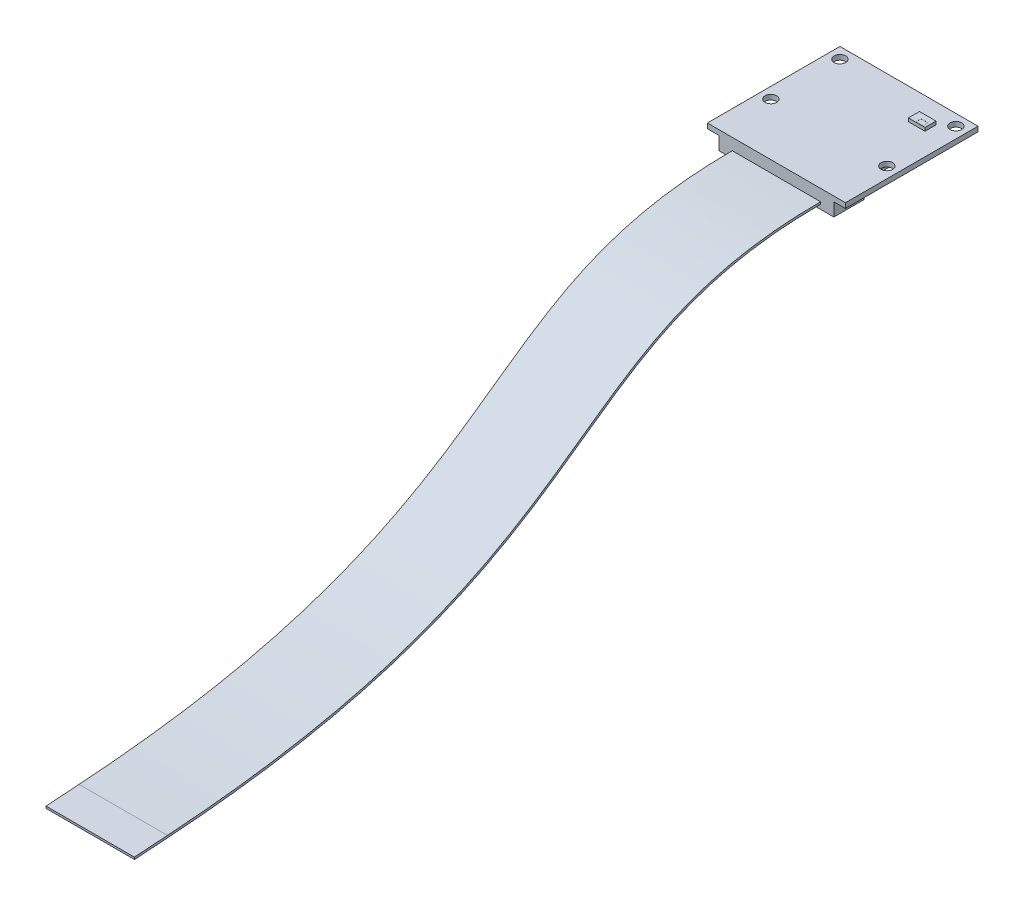
ISO-10303-21;
HEADER;
FILE_DESCRIPTION(('STEP AP214'),'2;1');
FILE_NAME('part.step','',(''),(''),'','','');
FILE_SCHEMA(('AUTOMOTIVE_DESIGN { 1 0 10303 214 1 1 1 1 }'));
ENDSEC;
DATA;
#1=APPLICATION_CONTEXT('core data for automotive mechanical design processes');
#2=APPLICATION_PROTOCOL_DEFINITION('international standard','automotive_design',2000,#1);
#3=PRODUCT_CONTEXT('',#1,'mechanical');
#4=PRODUCT('Part','Part','',(#3));
#5=PRODUCT_RELATED_PRODUCT_CATEGORY('part','',(#4));
#6=PRODUCT_DEFINITION_FORMATION('','',#4);
#7=PRODUCT_DEFINITION_CONTEXT('part definition',#1,'design');
#8=PRODUCT_DEFINITION('design','',#6,#7);
#9=PRODUCT_DEFINITION_SHAPE('','',#8);
#10=(LENGTH_UNIT() NAMED_UNIT(*) SI_UNIT(.MILLI.,.METRE.));
#11=(NAMED_UNIT(*) PLANE_ANGLE_UNIT() SI_UNIT($,.RADIAN.));
#12=(NAMED_UNIT(*) SI_UNIT($,.STERADIAN.) SOLID_ANGLE_UNIT());
#13=UNCERTAINTY_MEASURE_WITH_UNIT(LENGTH_MEASURE(1.E-05),#10,'distance_accuracy_value','');
#14=(GEOMETRIC_REPRESENTATION_CONTEXT(3) GLOBAL_UNCERTAINTY_ASSIGNED_CONTEXT((#13)) GLOBAL_UNIT_ASSIGNED_CONTEXT((#10,
#11,#12)) REPRESENTATION_CONTEXT('',''));
#15=CARTESIAN_POINT('',(0.,0.,0.));
#16=DIRECTION('',(0.,0.,1.));
#17=DIRECTION('',(1.,0.,0.));
#18=AXIS2_PLACEMENT_3D('',#15,#16,#17);
#19=CARTESIAN_POINT('',(0.,0.,0.));
#20=DIRECTION('',(0.,1.,0.));
#21=DIRECTION('',(0.,0.,1.));
#22=AXIS2_PLACEMENT_3D('',#19,#20,#21);
#23=PLANE('',#22);
#24=CARTESIAN_POINT('',(-10.5,0.,-12.5));
#25=DIRECTION('',(0.,1.,0.));
#26=DIRECTION('',(0.,0.,-1.));
#27=AXIS2_PLACEMENT_3D('',#24,#25,#26);
#28=CIRCLE('',#27,1.05);
#29=CARTESIAN_POINT('',(-10.5,0.,-13.55));
#30=VERTEX_POINT('',#29);
#31=EDGE_CURVE('E502',#30,#30,#28,.T.);
#32=ORIENTED_EDGE('',*,*,#31,.F.);
#33=EDGE_LOOP('',(#32));
#34=FACE_BOUND('',#33,.T.);
#35=CARTESIAN_POINT('',(-10.5,0.,0.));
#36=DIRECTION('',(0.,1.,0.));
#37=DIRECTION('',(0.,0.,-1.));
#38=AXIS2_PLACEMENT_3D('',#35,#36,#37);
#39=CIRCLE('',#38,1.05);
#40=CARTESIAN_POINT('',(-10.5,0.,-1.05));
#41=VERTEX_POINT('',#40);
#42=EDGE_CURVE('E508',#41,#41,#39,.T.);
#43=ORIENTED_EDGE('',*,*,#42,.F.);
#44=EDGE_LOOP('',(#43));
#45=FACE_BOUND('',#44,.T.);
#46=CARTESIAN_POINT('',(10.5,0.,0.));
#47=DIRECTION('',(0.,1.,0.));
#48=DIRECTION('',(0.,0.,1.));
#49=AXIS2_PLACEMENT_3D('',#46,#47,#48);
#50=CIRCLE('',#49,1.05);
#51=CARTESIAN_POINT('',(10.5,0.,1.05));
#52=VERTEX_POINT('',#51);
#53=EDGE_CURVE('E513',#52,#52,#50,.T.);
#54=ORIENTED_EDGE('',*,*,#53,.F.);
#55=EDGE_LOOP('',(#54));
#56=FACE_BOUND('',#55,.T.);
#57=CARTESIAN_POINT('',(10.5,0.,-12.5));
#58=DIRECTION('',(0.,1.,0.));
#59=DIRECTION('',(0.,0.,1.));
#60=AXIS2_PLACEMENT_3D('',#57,#58,#59);
#61=CIRCLE('',#60,1.05);
#62=CARTESIAN_POINT('',(10.5,0.,-11.45));
#63=VERTEX_POINT('',#62);
#64=EDGE_CURVE('E519',#63,#63,#61,.T.);
#65=ORIENTED_EDGE('',*,*,#64,.F.);
#66=EDGE_LOOP('',(#65));
#67=FACE_BOUND('',#66,.T.);
#68=DIRECTION('',(0.,0.,1.));
#69=VECTOR('',#68,1.);
#70=CARTESIAN_POINT('',(-12.5,0.,-14.5));
#71=LINE('',#70,#69);
#72=CARTESIAN_POINT('',(-12.5,0.,-14.5));
#73=VERTEX_POINT('',#72);
#74=CARTESIAN_POINT('',(-12.5,0.,9.5));
#75=VERTEX_POINT('',#74);
#76=EDGE_CURVE('E456',#73,#75,#71,.T.);
#77=ORIENTED_EDGE('',*,*,#76,.T.);
#78=DIRECTION('',(1.,0.,0.));
#79=VECTOR('',#78,1.);
#80=CARTESIAN_POINT('',(-12.5,0.,9.5));
#81=LINE('',#80,#79);
#82=CARTESIAN_POINT('',(12.5,0.,9.5));
#83=VERTEX_POINT('',#82);
#84=EDGE_CURVE('E459',#75,#83,#81,.T.);
#85=ORIENTED_EDGE('',*,*,#84,.T.);
#86=DIRECTION('',(0.,0.,-1.));
#87=VECTOR('',#86,1.);
#88=CARTESIAN_POINT('',(12.5,0.,-14.5));
#89=LINE('',#88,#87);
#90=CARTESIAN_POINT('',(12.5,0.,-14.5));
#91=VERTEX_POINT('',#90);
#92=EDGE_CURVE('E463',#83,#91,#89,.T.);
#93=ORIENTED_EDGE('',*,*,#92,.T.);
#94=DIRECTION('',(-1.,0.,0.));
#95=VECTOR('',#94,1.);
#96=CARTESIAN_POINT('',(-12.5,0.,-14.5));
#97=LINE('',#96,#95);
#98=EDGE_CURVE('E466',#91,#73,#97,.T.);
#99=ORIENTED_EDGE('',*,*,#98,.T.);
#100=EDGE_LOOP('',(#77,#85,#93,#99));
#101=FACE_BOUND('',#100,.T.);
#102=DIRECTION('',(1.,0.,0.));
#103=VECTOR('',#102,1.);
#104=CARTESIAN_POINT('',(5.5,0.,-8.90000000000001));
#105=LINE('',#104,#103);
#106=CARTESIAN_POINT('',(5.5,0.,-8.90000000000001));
#107=VERTEX_POINT('',#106);
#108=CARTESIAN_POINT('',(8.5,0.,-8.90000000000001));
#109=VERTEX_POINT('',#108);
#110=EDGE_CURVE('E278',#107,#109,#105,.T.);
#111=ORIENTED_EDGE('',*,*,#110,.F.);
#112=DIRECTION('',(0.,0.,1.));
#113=VECTOR('',#112,1.);
#114=CARTESIAN_POINT('',(5.5,0.,-10.9));
#115=LINE('',#114,#113);
#116=CARTESIAN_POINT('',(5.5,0.,-10.9));
#117=VERTEX_POINT('',#116);
#118=EDGE_CURVE('E261',#117,#107,#115,.T.);
#119=ORIENTED_EDGE('',*,*,#118,.F.);
#120=DIRECTION('',(-1.,0.,0.));
#121=VECTOR('',#120,1.);
#122=CARTESIAN_POINT('',(5.5,0.,-10.9));
#123=LINE('',#122,#121);
#124=CARTESIAN_POINT('',(8.5,0.,-10.9));
#125=VERTEX_POINT('',#124);
#126=EDGE_CURVE('E269',#125,#117,#123,.T.);
#127=ORIENTED_EDGE('',*,*,#126,.F.);
#128=DIRECTION('',(0.,0.,-1.));
#129=VECTOR('',#128,1.);
#130=CARTESIAN_POINT('',(8.5,0.,-10.9));
#131=LINE('',#130,#129);
#132=EDGE_CURVE('E280',#109,#125,#131,.T.);
#133=ORIENTED_EDGE('',*,*,#132,.F.);
#134=EDGE_LOOP('',(#111,#119,#127,#133));
#135=FACE_BOUND('',#134,.T.);
#136=ADVANCED_FACE('F51',(#34,#45,#56,#67,#101,#135),#23,.T.);
#137=CARTESIAN_POINT('',(0.,-0.9,0.));
#138=DIRECTION('',(0.,1.,0.));
#139=DIRECTION('',(0.,0.,1.));
#140=AXIS2_PLACEMENT_3D('',#137,#138,#139);
#141=PLANE('',#140);
#142=DIRECTION('',(0.,0.,-1.));
#143=VECTOR('',#142,1.);
#144=CARTESIAN_POINT('',(-10.4,-0.9,9.5));
#145=LINE('',#144,#143);
#146=CARTESIAN_POINT('',(-10.4,-0.9,9.5));
#147=VERTEX_POINT('',#146);
#148=CARTESIAN_POINT('',(-10.4,-0.9,4.));
#149=VERTEX_POINT('',#148);
#150=EDGE_CURVE('E398',#147,#149,#145,.T.);
#151=ORIENTED_EDGE('',*,*,#150,.F.);
#152=DIRECTION('',(1.,0.,0.));
#153=VECTOR('',#152,1.);
#154=CARTESIAN_POINT('',(-12.5,-0.9,9.5));
#155=LINE('',#154,#153);
#156=CARTESIAN_POINT('',(-12.5,-0.9,9.5));
#157=VERTEX_POINT('',#156);
#158=EDGE_CURVE('E441',#157,#147,#155,.T.);
#159=ORIENTED_EDGE('',*,*,#158,.F.);
#160=DIRECTION('',(0.,0.,1.));
#161=VECTOR('',#160,1.);
#162=CARTESIAN_POINT('',(-12.5,-0.9,-14.5));
#163=LINE('',#162,#161);
#164=CARTESIAN_POINT('',(-12.5,-0.9,-14.5));
#165=VERTEX_POINT('',#164);
#166=EDGE_CURVE('E442',#165,#157,#163,.T.);
#167=ORIENTED_EDGE('',*,*,#166,.F.);
#168=DIRECTION('',(-1.,0.,0.));
#169=VECTOR('',#168,1.);
#170=CARTESIAN_POINT('',(-12.5,-0.9,-14.5));
#171=LINE('',#170,#169);
#172=CARTESIAN_POINT('',(12.5,-0.9,-14.5));
#173=VERTEX_POINT('',#172);
#174=EDGE_CURVE('E452',#173,#165,#171,.T.);
#175=ORIENTED_EDGE('',*,*,#174,.F.);
#176=DIRECTION('',(0.,0.,-1.));
#177=VECTOR('',#176,1.);
#178=CARTESIAN_POINT('',(12.5,-0.9,-14.5));
#179=LINE('',#178,#177);
#180=CARTESIAN_POINT('',(12.5,-0.9,9.5));
#181=VERTEX_POINT('',#180);
#182=EDGE_CURVE('E448',#181,#173,#179,.T.);
#183=ORIENTED_EDGE('',*,*,#182,.F.);
#184=CARTESIAN_POINT('',(10.4,-0.9,9.5));
#185=VERTEX_POINT('',#184);
#186=EDGE_CURVE('E438',#185,#181,#155,.T.);
#187=ORIENTED_EDGE('',*,*,#186,.F.);
#188=DIRECTION('',(0.,0.,1.));
#189=VECTOR('',#188,1.);
#190=CARTESIAN_POINT('',(10.4,-0.9,9.5));
#191=LINE('',#190,#189);
#192=CARTESIAN_POINT('',(10.4,-0.9,4.));
#193=VERTEX_POINT('',#192);
#194=EDGE_CURVE('E403',#193,#185,#191,.T.);
#195=ORIENTED_EDGE('',*,*,#194,.F.);
#196=DIRECTION('',(1.,0.,0.));
#197=VECTOR('',#196,1.);
#198=CARTESIAN_POINT('',(-10.4,-0.9,4.));
#199=LINE('',#198,#197);
#200=EDGE_CURVE('E410',#149,#193,#199,.T.);
#201=ORIENTED_EDGE('',*,*,#200,.F.);
#202=EDGE_LOOP('',(#151,#159,#167,#175,#183,#187,#195,#201));
#203=FACE_BOUND('',#202,.T.);
#204=CARTESIAN_POINT('',(-10.5,-0.9,-12.5));
#205=DIRECTION('',(0.,1.,0.));
#206=DIRECTION('',(0.,0.,-1.));
#207=AXIS2_PLACEMENT_3D('',#204,#205,#206);
#208=CIRCLE('',#207,1.05);
#209=CARTESIAN_POINT('',(-10.5,-0.9,-13.55));
#210=VERTEX_POINT('',#209);
#211=EDGE_CURVE('E504',#210,#210,#208,.T.);
#212=ORIENTED_EDGE('',*,*,#211,.T.);
#213=EDGE_LOOP('',(#212));
#214=FACE_BOUND('',#213,.T.);
#215=CARTESIAN_POINT('',(-10.5,-0.9,0.));
#216=DIRECTION('',(0.,1.,0.));
#217=DIRECTION('',(0.,0.,-1.));
#218=AXIS2_PLACEMENT_3D('',#215,#216,#217);
#219=CIRCLE('',#218,1.05);
#220=CARTESIAN_POINT('',(-10.5,-0.9,-1.05));
#221=VERTEX_POINT('',#220);
#222=EDGE_CURVE('E510',#221,#221,#219,.T.);
#223=ORIENTED_EDGE('',*,*,#222,.T.);
#224=EDGE_LOOP('',(#223));
#225=FACE_BOUND('',#224,.T.);
#226=CARTESIAN_POINT('',(10.5,-0.9,0.));
#227=DIRECTION('',(0.,1.,0.));
#228=DIRECTION('',(0.,0.,1.));
#229=AXIS2_PLACEMENT_3D('',#226,#227,#228);
#230=CIRCLE('',#229,1.05);
#231=CARTESIAN_POINT('',(10.5,-0.9,1.05));
#232=VERTEX_POINT('',#231);
#233=EDGE_CURVE('E516',#232,#232,#230,.T.);
#234=ORIENTED_EDGE('',*,*,#233,.T.);
#235=EDGE_LOOP('',(#234));
#236=FACE_BOUND('',#235,.T.);
#237=CARTESIAN_POINT('',(10.5,-0.9,-12.5));
#238=DIRECTION('',(0.,1.,0.));
#239=DIRECTION('',(0.,0.,1.));
#240=AXIS2_PLACEMENT_3D('',#237,#238,#239);
#241=CIRCLE('',#240,1.05);
#242=CARTESIAN_POINT('',(10.5,-0.9,-11.45));
#243=VERTEX_POINT('',#242);
#244=EDGE_CURVE('E460',#243,#243,#241,.T.);
#245=ORIENTED_EDGE('',*,*,#244,.T.);
#246=EDGE_LOOP('',(#245));
#247=FACE_BOUND('',#246,.T.);
#248=DIRECTION('',(0.,0.,-1.));
#249=VECTOR('',#248,1.);
#250=CARTESIAN_POINT('',(-9.,-0.9,-0.900000000000005));
#251=LINE('',#250,#249);
#252=CARTESIAN_POINT('',(-9.,-0.9,-0.900000000000005));
#253=VERTEX_POINT('',#252);
#254=CARTESIAN_POINT('',(-9.,-0.9,-12.5));
#255=VERTEX_POINT('',#254);
#256=EDGE_CURVE('E365',#253,#255,#251,.T.);
#257=ORIENTED_EDGE('',*,*,#256,.F.);
#258=DIRECTION('',(-1.,0.,0.));
#259=VECTOR('',#258,1.);
#260=CARTESIAN_POINT('',(-9.,-0.9,-0.900000000000005));
#261=LINE('',#260,#259);
#262=CARTESIAN_POINT('',(8.7,-0.9,-0.900000000000005));
#263=VERTEX_POINT('',#262);
#264=EDGE_CURVE('E370',#263,#253,#261,.T.);
#265=ORIENTED_EDGE('',*,*,#264,.F.);
#266=DIRECTION('',(0.,0.,1.));
#267=VECTOR('',#266,1.);
#268=CARTESIAN_POINT('',(8.7,-0.9,-0.900000000000005));
#269=LINE('',#268,#267);
#270=CARTESIAN_POINT('',(8.7,-0.9,-12.5));
#271=VERTEX_POINT('',#270);
#272=EDGE_CURVE('E382',#271,#263,#269,.T.);
#273=ORIENTED_EDGE('',*,*,#272,.F.);
#274=DIRECTION('',(1.,0.,0.));
#275=VECTOR('',#274,1.);
#276=CARTESIAN_POINT('',(-9.,-0.9,-12.5));
#277=LINE('',#276,#275);
#278=EDGE_CURVE('E379',#255,#271,#277,.T.);
#279=ORIENTED_EDGE('',*,*,#278,.F.);
#280=EDGE_LOOP('',(#257,#265,#273,#279));
#281=FACE_BOUND('',#280,.T.);
#282=ADVANCED_FACE('F488',(#203,#214,#225,#236,#247,#281),#141,.F.);
#283=CARTESIAN_POINT('',(-12.5,-0.9,-14.5));
#284=DIRECTION('',(-1.,0.,0.));
#285=DIRECTION('',(0.,0.,1.));
#286=AXIS2_PLACEMENT_3D('',#283,#284,#285);
#287=PLANE('',#286);
#288=ORIENTED_EDGE('',*,*,#76,.F.);
#289=DIRECTION('',(0.,1.,0.));
#290=VECTOR('',#289,1.);
#291=CARTESIAN_POINT('',(-12.5,-0.9,-14.5));
#292=LINE('',#291,#290);
#293=EDGE_CURVE('E12',#165,#73,#292,.T.);
#294=ORIENTED_EDGE('',*,*,#293,.F.);
#295=ORIENTED_EDGE('',*,*,#166,.T.);
#296=DIRECTION('',(0.,1.,0.));
#297=VECTOR('',#296,1.);
#298=CARTESIAN_POINT('',(-12.5,-0.9,9.5));
#299=LINE('',#298,#297);
#300=EDGE_CURVE('E455',#157,#75,#299,.T.);
#301=ORIENTED_EDGE('',*,*,#300,.T.);
#302=EDGE_LOOP('',(#288,#294,#295,#301));
#303=FACE_BOUND('',#302,.T.);
#304=ADVANCED_FACE('F53',(#303),#287,.T.);
#305=CARTESIAN_POINT('',(-12.5,-0.9,-14.5));
#306=DIRECTION('',(0.,0.,-1.));
#307=DIRECTION('',(-1.,0.,0.));
#308=AXIS2_PLACEMENT_3D('',#305,#306,#307);
#309=PLANE('',#308);
#310=ORIENTED_EDGE('',*,*,#98,.F.);
#311=DIRECTION('',(0.,1.,0.));
#312=VECTOR('',#311,1.);
#313=CARTESIAN_POINT('',(12.5,-0.9,-14.5));
#314=LINE('',#313,#312);
#315=EDGE_CURVE('E60',#173,#91,#314,.T.);
#316=ORIENTED_EDGE('',*,*,#315,.F.);
#317=ORIENTED_EDGE('',*,*,#174,.T.);
#318=ORIENTED_EDGE('',*,*,#293,.T.);
#319=EDGE_LOOP('',(#310,#316,#317,#318));
#320=FACE_BOUND('',#319,.T.);
#321=ADVANCED_FACE('F485',(#320),#309,.T.);
#322=CARTESIAN_POINT('',(12.5,-0.9,-14.5));
#323=DIRECTION('',(1.,0.,0.));
#324=DIRECTION('',(0.,0.,-1.));
#325=AXIS2_PLACEMENT_3D('',#322,#323,#324);
#326=PLANE('',#325);
#327=ORIENTED_EDGE('',*,*,#92,.F.);
#328=DIRECTION('',(0.,1.,0.));
#329=VECTOR('',#328,1.);
#330=CARTESIAN_POINT('',(12.5,-0.9,9.5));
#331=LINE('',#330,#329);
#332=EDGE_CURVE('E470',#181,#83,#331,.T.);
#333=ORIENTED_EDGE('',*,*,#332,.F.);
#334=ORIENTED_EDGE('',*,*,#182,.T.);
#335=ORIENTED_EDGE('',*,*,#315,.T.);
#336=EDGE_LOOP('',(#327,#333,#334,#335));
#337=FACE_BOUND('',#336,.T.);
#338=ADVANCED_FACE('F543',(#337),#326,.T.);
#339=CARTESIAN_POINT('',(-12.5,-0.9,9.5));
#340=DIRECTION('',(0.,0.,1.));
#341=DIRECTION('',(1.,0.,0.));
#342=AXIS2_PLACEMENT_3D('',#339,#340,#341);
#343=PLANE('',#342);
#344=DIRECTION('',(0.,-1.,0.));
#345=VECTOR('',#344,1.);
#346=CARTESIAN_POINT('',(-8.,-2.1,9.5));
#347=LINE('',#346,#345);
#348=CARTESIAN_POINT('',(-8.,-2.1,9.5));
#349=VERTEX_POINT('',#348);
#350=CARTESIAN_POINT('',(-8.,-2.5,9.5));
#351=VERTEX_POINT('',#350);
#352=EDGE_CURVE('E292',#349,#351,#347,.T.);
#353=ORIENTED_EDGE('',*,*,#352,.F.);
#354=DIRECTION('',(-1.,0.,0.));
#355=VECTOR('',#354,1.);
#356=CARTESIAN_POINT('',(-8.,-2.1,9.5));
#357=LINE('',#356,#355);
#358=CARTESIAN_POINT('',(8.,-2.1,9.5));
#359=VERTEX_POINT('',#358);
#360=EDGE_CURVE('E302',#359,#349,#357,.T.);
#361=ORIENTED_EDGE('',*,*,#360,.F.);
#362=DIRECTION('',(0.,1.,0.));
#363=VECTOR('',#362,1.);
#364=CARTESIAN_POINT('',(8.,-2.1,9.5));
#365=LINE('',#364,#363);
#366=CARTESIAN_POINT('',(8.,-2.5,9.5));
#367=VERTEX_POINT('',#366);
#368=EDGE_CURVE('E299',#367,#359,#365,.T.);
#369=ORIENTED_EDGE('',*,*,#368,.F.);
#370=DIRECTION('',(1.,0.,0.));
#371=VECTOR('',#370,1.);
#372=CARTESIAN_POINT('',(-8.,-2.5,9.5));
#373=LINE('',#372,#371);
#374=EDGE_CURVE('E295',#351,#367,#373,.T.);
#375=ORIENTED_EDGE('',*,*,#374,.F.);
#376=EDGE_LOOP('',(#353,#361,#369,#375));
#377=FACE_BOUND('',#376,.T.);
#378=ORIENTED_EDGE('',*,*,#84,.F.);
#379=ORIENTED_EDGE('',*,*,#300,.F.);
#380=ORIENTED_EDGE('',*,*,#158,.T.);
#381=DIRECTION('',(0.,1.,0.));
#382=VECTOR('',#381,1.);
#383=CARTESIAN_POINT('',(-10.4,-3.3,9.5));
#384=LINE('',#383,#382);
#385=CARTESIAN_POINT('',(-10.4,-3.3,9.5));
#386=VERTEX_POINT('',#385);
#387=EDGE_CURVE('E409',#386,#147,#384,.T.);
#388=ORIENTED_EDGE('',*,*,#387,.F.);
#389=DIRECTION('',(-1.,0.,0.));
#390=VECTOR('',#389,1.);
#391=CARTESIAN_POINT('',(-10.4,-3.3,9.5));
#392=LINE('',#391,#390);
#393=CARTESIAN_POINT('',(10.4,-3.3,9.5));
#394=VERTEX_POINT('',#393);
#395=EDGE_CURVE('E407',#394,#386,#392,.T.);
#396=ORIENTED_EDGE('',*,*,#395,.F.);
#397=DIRECTION('',(0.,1.,0.));
#398=VECTOR('',#397,1.);
#399=CARTESIAN_POINT('',(10.4,-3.3,9.5));
#400=LINE('',#399,#398);
#401=EDGE_CURVE('E422',#394,#185,#400,.T.);
#402=ORIENTED_EDGE('',*,*,#401,.T.);
#403=ORIENTED_EDGE('',*,*,#186,.T.);
#404=ORIENTED_EDGE('',*,*,#332,.T.);
#405=EDGE_LOOP('',(#378,#379,#380,#388,#396,#402,#403,#404));
#406=FACE_BOUND('',#405,.T.);
#407=ADVANCED_FACE('F478',(#377,#406),#343,.T.);
#408=CARTESIAN_POINT('',(10.5,-0.9,-12.5));
#409=DIRECTION('',(0.,1.,0.));
#410=DIRECTION('',(0.,0.,1.));
#411=AXIS2_PLACEMENT_3D('',#408,#409,#410);
#412=CYLINDRICAL_SURFACE('',#411,1.05);
#413=ORIENTED_EDGE('',*,*,#244,.F.);
#414=EDGE_LOOP('',(#413));
#415=FACE_BOUND('',#414,.T.);
#416=ORIENTED_EDGE('',*,*,#64,.T.);
#417=EDGE_LOOP('',(#416));
#418=FACE_BOUND('',#417,.T.);
#419=ADVANCED_FACE('F526',(#415,#418),#412,.F.);
#420=CARTESIAN_POINT('',(10.5,-0.9,0.));
#421=DIRECTION('',(0.,1.,0.));
#422=DIRECTION('',(0.,0.,1.));
#423=AXIS2_PLACEMENT_3D('',#420,#421,#422);
#424=CYLINDRICAL_SURFACE('',#423,1.05);
#425=ORIENTED_EDGE('',*,*,#233,.F.);
#426=EDGE_LOOP('',(#425));
#427=FACE_BOUND('',#426,.T.);
#428=ORIENTED_EDGE('',*,*,#53,.T.);
#429=EDGE_LOOP('',(#428));
#430=FACE_BOUND('',#429,.T.);
#431=ADVANCED_FACE('F553',(#427,#430),#424,.F.);
#432=CARTESIAN_POINT('',(-10.5,-0.9,0.));
#433=DIRECTION('',(0.,1.,0.));
#434=DIRECTION('',(0.,0.,1.));
#435=AXIS2_PLACEMENT_3D('',#432,#433,#434);
#436=CYLINDRICAL_SURFACE('',#435,1.05);
#437=ORIENTED_EDGE('',*,*,#222,.F.);
#438=EDGE_LOOP('',(#437));
#439=FACE_BOUND('',#438,.T.);
#440=ORIENTED_EDGE('',*,*,#42,.T.);
#441=EDGE_LOOP('',(#440));
#442=FACE_BOUND('',#441,.T.);
#443=ADVANCED_FACE('F621',(#439,#442),#436,.F.);
#444=CARTESIAN_POINT('',(-10.5,-0.9,-12.5));
#445=DIRECTION('',(0.,1.,0.));
#446=DIRECTION('',(0.,0.,1.));
#447=AXIS2_PLACEMENT_3D('',#444,#445,#446);
#448=CYLINDRICAL_SURFACE('',#447,1.05);
#449=ORIENTED_EDGE('',*,*,#211,.F.);
#450=EDGE_LOOP('',(#449));
#451=FACE_BOUND('',#450,.T.);
#452=ORIENTED_EDGE('',*,*,#31,.T.);
#453=EDGE_LOOP('',(#452));
#454=FACE_BOUND('',#453,.T.);
#455=ADVANCED_FACE('F618',(#451,#454),#448,.F.);
#456=CARTESIAN_POINT('',(-10.4,-3.3,9.5));
#457=DIRECTION('',(1.,0.,0.));
#458=DIRECTION('',(0.,0.,-1.));
#459=AXIS2_PLACEMENT_3D('',#456,#457,#458);
#460=PLANE('',#459);
#461=ORIENTED_EDGE('',*,*,#150,.T.);
#462=DIRECTION('',(0.,1.,0.));
#463=VECTOR('',#462,1.);
#464=CARTESIAN_POINT('',(-10.4,-3.3,4.));
#465=LINE('',#464,#463);
#466=CARTESIAN_POINT('',(-10.4,-3.3,4.));
#467=VERTEX_POINT('',#466);
#468=EDGE_CURVE('E428',#467,#149,#465,.T.);
#469=ORIENTED_EDGE('',*,*,#468,.F.);
#470=DIRECTION('',(0.,0.,-1.));
#471=VECTOR('',#470,1.);
#472=CARTESIAN_POINT('',(-10.4,-3.3,9.5));
#473=LINE('',#472,#471);
#474=EDGE_CURVE('E399',#386,#467,#473,.T.);
#475=ORIENTED_EDGE('',*,*,#474,.F.);
#476=ORIENTED_EDGE('',*,*,#387,.T.);
#477=EDGE_LOOP('',(#461,#469,#475,#476));
#478=FACE_BOUND('',#477,.T.);
#479=ADVANCED_FACE('F492',(#478),#460,.F.);
#480=CARTESIAN_POINT('',(-10.4,-3.3,4.));
#481=DIRECTION('',(0.,0.,1.));
#482=DIRECTION('',(1.,0.,0.));
#483=AXIS2_PLACEMENT_3D('',#480,#481,#482);
#484=PLANE('',#483);
#485=ORIENTED_EDGE('',*,*,#200,.T.);
#486=DIRECTION('',(0.,1.,0.));
#487=VECTOR('',#486,1.);
#488=CARTESIAN_POINT('',(10.4,-3.3,4.));
#489=LINE('',#488,#487);
#490=CARTESIAN_POINT('',(10.4,-3.3,4.));
#491=VERTEX_POINT('',#490);
#492=EDGE_CURVE('E415',#491,#193,#489,.T.);
#493=ORIENTED_EDGE('',*,*,#492,.F.);
#494=DIRECTION('',(1.,0.,0.));
#495=VECTOR('',#494,1.);
#496=CARTESIAN_POINT('',(-10.4,-3.3,4.));
#497=LINE('',#496,#495);
#498=EDGE_CURVE('E402',#467,#491,#497,.T.);
#499=ORIENTED_EDGE('',*,*,#498,.F.);
#500=ORIENTED_EDGE('',*,*,#468,.T.);
#501=EDGE_LOOP('',(#485,#493,#499,#500));
#502=FACE_BOUND('',#501,.T.);
#503=ADVANCED_FACE('F501',(#502),#484,.F.);
#504=CARTESIAN_POINT('',(10.4,-3.3,9.5));
#505=DIRECTION('',(-1.,0.,0.));
#506=DIRECTION('',(0.,0.,1.));
#507=AXIS2_PLACEMENT_3D('',#504,#505,#506);
#508=PLANE('',#507);
#509=ORIENTED_EDGE('',*,*,#194,.T.);
#510=ORIENTED_EDGE('',*,*,#401,.F.);
#511=DIRECTION('',(0.,0.,1.));
#512=VECTOR('',#511,1.);
#513=CARTESIAN_POINT('',(10.4,-3.3,9.5));
#514=LINE('',#513,#512);
#515=EDGE_CURVE('E405',#491,#394,#514,.T.);
#516=ORIENTED_EDGE('',*,*,#515,.F.);
#517=ORIENTED_EDGE('',*,*,#492,.T.);
#518=EDGE_LOOP('',(#509,#510,#516,#517));
#519=FACE_BOUND('',#518,.T.);
#520=ADVANCED_FACE('F499',(#519),#508,.F.);
#521=CARTESIAN_POINT('',(0.,-3.3,0.));
#522=DIRECTION('',(0.,-1.,0.));
#523=DIRECTION('',(0.,0.,-1.));
#524=AXIS2_PLACEMENT_3D('',#521,#522,#523);
#525=PLANE('',#524);
#526=ORIENTED_EDGE('',*,*,#474,.T.);
#527=ORIENTED_EDGE('',*,*,#498,.T.);
#528=ORIENTED_EDGE('',*,*,#515,.T.);
#529=ORIENTED_EDGE('',*,*,#395,.T.);
#530=EDGE_LOOP('',(#526,#527,#528,#529));
#531=FACE_BOUND('',#530,.T.);
#532=ADVANCED_FACE('F495',(#531),#525,.T.);
#533=CARTESIAN_POINT('',(-9.,-2.2,-0.900000000000005));
#534=DIRECTION('',(1.,0.,0.));
#535=DIRECTION('',(0.,0.,-1.));
#536=AXIS2_PLACEMENT_3D('',#533,#534,#535);
#537=PLANE('',#536);
#538=ORIENTED_EDGE('',*,*,#256,.T.);
#539=DIRECTION('',(0.,1.,0.));
#540=VECTOR('',#539,1.);
#541=CARTESIAN_POINT('',(-9.,-2.2,-12.5));
#542=LINE('',#541,#540);
#543=CARTESIAN_POINT('',(-9.,-2.2,-12.5));
#544=VERTEX_POINT('',#543);
#545=EDGE_CURVE('E395',#544,#255,#542,.T.);
#546=ORIENTED_EDGE('',*,*,#545,.F.);
#547=DIRECTION('',(0.,0.,-1.));
#548=VECTOR('',#547,1.);
#549=CARTESIAN_POINT('',(-9.,-2.2,-0.900000000000005));
#550=LINE('',#549,#548);
#551=CARTESIAN_POINT('',(-9.,-2.2,-0.900000000000005));
#552=VERTEX_POINT('',#551);
#553=EDGE_CURVE('E366',#552,#544,#550,.T.);
#554=ORIENTED_EDGE('',*,*,#553,.F.);
#555=DIRECTION('',(0.,1.,0.));
#556=VECTOR('',#555,1.);
#557=CARTESIAN_POINT('',(-9.,-2.2,-0.900000000000005));
#558=LINE('',#557,#556);
#559=EDGE_CURVE('E376',#552,#253,#558,.T.);
#560=ORIENTED_EDGE('',*,*,#559,.T.);
#561=EDGE_LOOP('',(#538,#546,#554,#560));
#562=FACE_BOUND('',#561,.T.);
#563=ADVANCED_FACE('F605',(#562),#537,.F.);
#564=CARTESIAN_POINT('',(-9.,-2.2,-12.5));
#565=DIRECTION('',(0.,0.,1.));
#566=DIRECTION('',(1.,0.,0.));
#567=AXIS2_PLACEMENT_3D('',#564,#565,#566);
#568=PLANE('',#567);
#569=ORIENTED_EDGE('',*,*,#278,.T.);
#570=DIRECTION('',(0.,1.,0.));
#571=VECTOR('',#570,1.);
#572=CARTESIAN_POINT('',(8.7,-2.2,-12.5));
#573=LINE('',#572,#571);
#574=CARTESIAN_POINT('',(8.7,-2.2,-12.5));
#575=VERTEX_POINT('',#574);
#576=EDGE_CURVE('E392',#575,#271,#573,.T.);
#577=ORIENTED_EDGE('',*,*,#576,.F.);
#578=DIRECTION('',(1.,0.,0.));
#579=VECTOR('',#578,1.);
#580=CARTESIAN_POINT('',(-9.,-2.2,-12.5));
#581=LINE('',#580,#579);
#582=EDGE_CURVE('E369',#544,#575,#581,.T.);
#583=ORIENTED_EDGE('',*,*,#582,.F.);
#584=ORIENTED_EDGE('',*,*,#545,.T.);
#585=EDGE_LOOP('',(#569,#577,#583,#584));
#586=FACE_BOUND('',#585,.T.);
#587=ADVANCED_FACE('F601',(#586),#568,.F.);
#588=CARTESIAN_POINT('',(8.7,-2.2,-0.900000000000005));
#589=DIRECTION('',(-1.,0.,0.));
#590=DIRECTION('',(0.,0.,1.));
#591=AXIS2_PLACEMENT_3D('',#588,#589,#590);
#592=PLANE('',#591);
#593=ORIENTED_EDGE('',*,*,#272,.T.);
#594=DIRECTION('',(0.,1.,0.));
#595=VECTOR('',#594,1.);
#596=CARTESIAN_POINT('',(8.7,-2.2,-0.900000000000005));
#597=LINE('',#596,#595);
#598=CARTESIAN_POINT('',(8.7,-2.2,-0.900000000000005));
#599=VERTEX_POINT('',#598);
#600=EDGE_CURVE('E389',#599,#263,#597,.T.);
#601=ORIENTED_EDGE('',*,*,#600,.F.);
#602=DIRECTION('',(0.,0.,1.));
#603=VECTOR('',#602,1.);
#604=CARTESIAN_POINT('',(8.7,-2.2,-0.900000000000005));
#605=LINE('',#604,#603);
#606=EDGE_CURVE('E372',#575,#599,#605,.T.);
#607=ORIENTED_EDGE('',*,*,#606,.F.);
#608=ORIENTED_EDGE('',*,*,#576,.T.);
#609=EDGE_LOOP('',(#593,#601,#607,#608));
#610=FACE_BOUND('',#609,.T.);
#611=ADVANCED_FACE('F597',(#610),#592,.F.);
#612=CARTESIAN_POINT('',(-9.,-2.2,-0.900000000000005));
#613=DIRECTION('',(0.,0.,-1.));
#614=DIRECTION('',(-1.,0.,0.));
#615=AXIS2_PLACEMENT_3D('',#612,#613,#614);
#616=PLANE('',#615);
#617=ORIENTED_EDGE('',*,*,#264,.T.);
#618=ORIENTED_EDGE('',*,*,#559,.F.);
#619=DIRECTION('',(-1.,0.,0.));
#620=VECTOR('',#619,1.);
#621=CARTESIAN_POINT('',(-9.,-2.2,-0.900000000000005));
#622=LINE('',#621,#620);
#623=EDGE_CURVE('E374',#599,#552,#622,.T.);
#624=ORIENTED_EDGE('',*,*,#623,.F.);
#625=ORIENTED_EDGE('',*,*,#600,.T.);
#626=EDGE_LOOP('',(#617,#618,#624,#625));
#627=FACE_BOUND('',#626,.T.);
#628=ADVANCED_FACE('F593',(#627),#616,.F.);
#629=CARTESIAN_POINT('',(0.,-2.2,0.));
#630=DIRECTION('',(0.,-1.,0.));
#631=DIRECTION('',(0.,0.,-1.));
#632=AXIS2_PLACEMENT_3D('',#629,#630,#631);
#633=PLANE('',#632);
#634=ORIENTED_EDGE('',*,*,#553,.T.);
#635=ORIENTED_EDGE('',*,*,#582,.T.);
#636=ORIENTED_EDGE('',*,*,#606,.T.);
#637=ORIENTED_EDGE('',*,*,#623,.T.);
#638=EDGE_LOOP('',(#634,#635,#636,#637));
#639=FACE_BOUND('',#638,.T.);
#640=ADVANCED_FACE('F582',(#639),#633,.T.);
#641=CARTESIAN_POINT('',(-8.,-42.7223523254804,127.722548323079));
#642=DIRECTION('',(0.,-0.997643728394005,-0.0686075155949291));
#643=DIRECTION('',(0.,0.0686075155949291,-0.997643728394005));
#644=AXIS2_PLACEMENT_3D('',#641,#642,#643);
#645=PLANE('',#644);
#646=DIRECTION('',(1.,0.,0.));
#647=VECTOR('',#646,1.);
#648=CARTESIAN_POINT('',(-8.,-42.7223523254804,127.722548323079));
#649=LINE('',#648,#647);
#650=CARTESIAN_POINT('',(-8.,-42.7223523254804,127.722548323079));
#651=VERTEX_POINT('',#650);
#652=CARTESIAN_POINT('',(8.,-42.7223523254804,127.722548323079));
#653=VERTEX_POINT('',#652);
#654=EDGE_CURVE('E291',#651,#653,#649,.T.);
#655=ORIENTED_EDGE('',*,*,#654,.T.);
#656=DIRECTION('',(0.,-0.0686075155949291,0.997643728394005));
#657=VECTOR('',#656,1.);
#658=CARTESIAN_POINT('',(8.,-42.7223523254804,127.722548323079));
#659=LINE('',#658,#657);
#660=CARTESIAN_POINT('',(8.,-43.13399741905,133.708410693443));
#661=VERTEX_POINT('',#660);
#662=EDGE_CURVE('E359',#653,#661,#659,.T.);
#663=ORIENTED_EDGE('',*,*,#662,.T.);
#664=DIRECTION('',(1.,0.,0.));
#665=VECTOR('',#664,1.);
#666=CARTESIAN_POINT('',(-8.,-43.1339974190499,133.708410693443));
#667=LINE('',#666,#665);
#668=CARTESIAN_POINT('',(-8.,-43.13399741905,133.708410693443));
#669=VERTEX_POINT('',#668);
#670=EDGE_CURVE('E350',#669,#661,#667,.T.);
#671=ORIENTED_EDGE('',*,*,#670,.F.);
#672=DIRECTION('',(0.,-0.0686075155949291,0.997643728394005));
#673=VECTOR('',#672,1.);
#674=CARTESIAN_POINT('',(-8.,-42.7223523254804,127.722548323079));
#675=LINE('',#674,#673);
#676=EDGE_CURVE('E362',#651,#669,#675,.T.);
#677=ORIENTED_EDGE('',*,*,#676,.F.);
#678=EDGE_LOOP('',(#655,#663,#671,#677));
#679=FACE_BOUND('',#678,.T.);
#680=ADVANCED_FACE('F570',(#679),#645,.T.);
#681=CARTESIAN_POINT('',(-8.,-42.3232948341228,127.749991329317));
#682=DIRECTION('',(0.,0.997643728394005,0.0686075155949291));
#683=DIRECTION('',(0.,-0.0686075155949291,0.997643728394005));
#684=AXIS2_PLACEMENT_3D('',#681,#682,#683);
#685=PLANE('',#684);
#686=DIRECTION('',(-1.,0.,0.));
#687=VECTOR('',#686,1.);
#688=CARTESIAN_POINT('',(-8.,-42.3232948341228,127.749991329317));
#689=LINE('',#688,#687);
#690=CARTESIAN_POINT('',(8.,-42.3232948341228,127.749991329317));
#691=VERTEX_POINT('',#690);
#692=CARTESIAN_POINT('',(-8.,-42.3232948341228,127.749991329317));
#693=VERTEX_POINT('',#692);
#694=EDGE_CURVE('E320',#691,#693,#689,.T.);
#695=ORIENTED_EDGE('',*,*,#694,.T.);
#696=DIRECTION('',(0.,-0.0686075155949291,0.997643728394005));
#697=VECTOR('',#696,1.);
#698=CARTESIAN_POINT('',(-8.,-42.3232948341228,127.749991329317));
#699=LINE('',#698,#697);
#700=CARTESIAN_POINT('',(-8.,-42.7349399276923,133.735853699681));
#701=VERTEX_POINT('',#700);
#702=EDGE_CURVE('E353',#693,#701,#699,.T.);
#703=ORIENTED_EDGE('',*,*,#702,.T.);
#704=DIRECTION('',(-1.,0.,0.));
#705=VECTOR('',#704,1.);
#706=CARTESIAN_POINT('',(-8.,-42.7349399276923,133.735853699681));
#707=LINE('',#706,#705);
#708=CARTESIAN_POINT('',(8.,-42.7349399276923,133.735853699681));
#709=VERTEX_POINT('',#708);
#710=EDGE_CURVE('E344',#709,#701,#707,.T.);
#711=ORIENTED_EDGE('',*,*,#710,.F.);
#712=DIRECTION('',(0.,-0.0686075155949291,0.997643728394005));
#713=VECTOR('',#712,1.);
#714=CARTESIAN_POINT('',(8.,-42.3232948341228,127.749991329317));
#715=LINE('',#714,#713);
#716=EDGE_CURVE('E356',#691,#709,#715,.T.);
#717=ORIENTED_EDGE('',*,*,#716,.F.);
#718=EDGE_LOOP('',(#695,#703,#711,#717));
#719=FACE_BOUND('',#718,.T.);
#720=ADVANCED_FACE('F574',(#719),#685,.T.);
#721=CARTESIAN_POINT('',(0.,-40.6398880980649,133.87992948243));
#722=DIRECTION('',(0.,-0.0686075155949264,0.997643728394006));
#723=DIRECTION('',(1.,0.,0.));
#724=AXIS2_PLACEMENT_3D('',#721,#722,#723);
#725=PLANE('',#724);
#726=DIRECTION('',(0.,-0.997643728394005,-0.0686075155949264));
#727=VECTOR('',#726,1.);
#728=CARTESIAN_POINT('',(-8.,-42.7349399276923,133.735853699681));
#729=LINE('',#728,#727);
#730=EDGE_CURVE('E305',#701,#669,#729,.T.);
#731=ORIENTED_EDGE('',*,*,#730,.T.);
#732=ORIENTED_EDGE('',*,*,#670,.T.);
#733=DIRECTION('',(0.,0.997643728394005,0.0686075155949264));
#734=VECTOR('',#733,1.);
#735=CARTESIAN_POINT('',(8.,-42.7349399276923,133.735853699681));
#736=LINE('',#735,#734);
#737=EDGE_CURVE('E347',#661,#709,#736,.T.);
#738=ORIENTED_EDGE('',*,*,#737,.T.);
#739=ORIENTED_EDGE('',*,*,#710,.T.);
#740=EDGE_LOOP('',(#731,#732,#738,#739));
#741=FACE_BOUND('',#740,.T.);
#742=ADVANCED_FACE('F572',(#741),#725,.T.);
#743=CARTESIAN_POINT('',(8.,-2.1,9.5));
#744=CARTESIAN_POINT('',(8.,-2.1,16.2848157386726));
#745=CARTESIAN_POINT('',(8.,-3.45978424975024,27.5353360936121));
#746=CARTESIAN_POINT('',(8.,-8.52772154509005,39.9290481376773));
#747=CARTESIAN_POINT('',(8.,-15.572827932608,50.3159565722721));
#748=CARTESIAN_POINT('',(8.,-22.9746413229706,60.3959427259844));
#749=CARTESIAN_POINT('',(8.,-29.7114100406269,71.9533969735003));
#750=CARTESIAN_POINT('',(8.,-35.2997631812119,85.5656781565225));
#751=CARTESIAN_POINT('',(8.,-39.7912573128702,103.396555258911));
#752=CARTESIAN_POINT('',(8.,-41.7144535113623,118.89663580446));
#753=CARTESIAN_POINT('',(8.,-42.3232948341228,127.749991329317));
#754=CARTESIAN_POINT('',(-8.,-2.1,9.5));
#755=CARTESIAN_POINT('',(-8.,-2.1,16.2848157386726));
#756=CARTESIAN_POINT('',(-8.,-3.45978424975024,27.5353360936121));
#757=CARTESIAN_POINT('',(-8.,-8.52772154509005,39.9290481376773));
#758=CARTESIAN_POINT('',(-8.,-15.572827932608,50.3159565722721));
#759=CARTESIAN_POINT('',(-8.,-22.9746413229706,60.3959427259844));
#760=CARTESIAN_POINT('',(-8.,-29.7114100406269,71.9533969735003));
#761=CARTESIAN_POINT('',(-8.,-35.2997631812119,85.5656781565225));
#762=CARTESIAN_POINT('',(-8.,-39.7912573128702,103.396555258911));
#763=CARTESIAN_POINT('',(-8.,-41.7144535113623,118.89663580446));
#764=CARTESIAN_POINT('',(-8.,-42.3232948341228,127.749991329317));
#765=B_SPLINE_SURFACE_WITH_KNOTS('',1,3,((#743,#744,#745,#746,#747,#748,#749,#750,#751,#752,
#753),(#754,#755,#756,#757,#758,#759,#760,#761,#762,#763,#764)),.UNSPECIFIED.,.F.,.F.,.F.,(2,2),
(4,1,1,1,1,1,1,1,4),(0.51219512195122,1.),(0.,0.14,0.28,0.420000000000001,0.560000000000001,
0.67,0.78,0.89,1.),.UNSPECIFIED.);
#766=CARTESIAN_POINT('',(-8.,-2.1,9.5));
#767=CARTESIAN_POINT('',(-8.,-2.1,16.2848157386726));
#768=CARTESIAN_POINT('',(-8.,-3.45978424975024,27.5353360936121));
#769=CARTESIAN_POINT('',(-8.,-8.52772154509005,39.9290481376773));
#770=CARTESIAN_POINT('',(-8.,-15.572827932608,50.3159565722721));
#771=CARTESIAN_POINT('',(-8.,-22.9746413229706,60.3959427259844));
#772=CARTESIAN_POINT('',(-8.,-29.7114100406269,71.9533969735003));
#773=CARTESIAN_POINT('',(-8.,-35.2997631812119,85.5656781565225));
#774=CARTESIAN_POINT('',(-8.,-39.7912573128702,103.396555258911));
#775=CARTESIAN_POINT('',(-8.,-41.7144535113623,118.89663580446));
#776=CARTESIAN_POINT('',(-8.,-42.3232948341228,127.749991329317));
#777=B_SPLINE_CURVE_WITH_KNOTS('',3,(#766,#767,#768,#769,#770,#771,#772,#773,#774,#775,#776),
.UNSPECIFIED.,.F.,.F.,(4,1,1,1,1,1,1,1,4),(0.,0.14,0.28,0.420000000000001,0.560000000000001,
0.67,0.78,0.89,1.),.UNSPECIFIED.);
#778=EDGE_CURVE('E296',#349,#693,#777,.T.);
#779=CARTESIAN_POINT('',(8.,-2.1,9.5));
#780=CARTESIAN_POINT('',(8.,-2.1,16.2848157386726));
#781=CARTESIAN_POINT('',(8.,-3.45978424975024,27.5353360936121));
#782=CARTESIAN_POINT('',(8.,-8.52772154509005,39.9290481376773));
#783=CARTESIAN_POINT('',(8.,-15.572827932608,50.3159565722721));
#784=CARTESIAN_POINT('',(8.,-22.9746413229706,60.3959427259844));
#785=CARTESIAN_POINT('',(8.,-29.7114100406269,71.9533969735003));
#786=CARTESIAN_POINT('',(8.,-35.2997631812119,85.5656781565225));
#787=CARTESIAN_POINT('',(8.,-39.7912573128702,103.396555258911));
#788=CARTESIAN_POINT('',(8.,-41.7144535113623,118.89663580446));
#789=CARTESIAN_POINT('',(8.,-42.3232948341228,127.749991329317));
#790=B_SPLINE_CURVE_WITH_KNOTS('',3,(#779,#780,#781,#782,#783,#784,#785,#786,#787,#788,#789),
.UNSPECIFIED.,.F.,.F.,(4,1,1,1,1,1,1,1,4),(0.,0.14,0.28,0.420000000000001,0.560000000000001,
0.67,0.78,0.89,1.),.UNSPECIFIED.);
#791=EDGE_CURVE('E310',#359,#691,#790,.T.);
#792=ORIENTED_EDGE('',*,*,#360,.T.);
#793=ORIENTED_EDGE('',*,*,#778,.T.);
#794=ORIENTED_EDGE('',*,*,#694,.F.);
#795=ORIENTED_EDGE('',*,*,#791,.F.);
#796=EDGE_LOOP('',(#792,#793,#794,#795));
#797=FACE_BOUND('',#796,.T.);
#798=ADVANCED_FACE('F562',(#797),#765,.T.);
#799=CARTESIAN_POINT('',(8.,-2.5,9.5));
#800=DIRECTION('',(1.,0.,0.));
#801=DIRECTION('',(0.,1.,0.));
#802=AXIS2_PLACEMENT_3D('',#799,#800,#801);
#803=PLANE('',#802);
#804=ORIENTED_EDGE('',*,*,#368,.T.);
#805=ORIENTED_EDGE('',*,*,#791,.T.);
#806=ORIENTED_EDGE('',*,*,#716,.T.);
#807=ORIENTED_EDGE('',*,*,#737,.F.);
#808=ORIENTED_EDGE('',*,*,#662,.F.);
#809=CARTESIAN_POINT('',(8.,-2.5,9.5));
#810=CARTESIAN_POINT('',(8.,-2.49841460345686,16.254158147279));
#811=CARTESIAN_POINT('',(8.,-3.85502806012083,27.4433633194311));
#812=CARTESIAN_POINT('',(8.,-8.87896783161381,39.730597690538));
#813=CARTESIAN_POINT('',(8.,-15.8916588197201,50.0749723412408));
#814=CARTESIAN_POINT('',(8.,-23.3068220145092,60.1716667715183));
#815=CARTESIAN_POINT('',(8.,-30.0718109632045,71.7766705402053));
#816=CARTESIAN_POINT('',(8.,-35.6822284512493,85.4438786690711));
#817=CARTESIAN_POINT('',(8.,-40.1864324064091,103.3278287845));
#818=CARTESIAN_POINT('',(8.,-42.1122168701137,118.855431642164));
#819=CARTESIAN_POINT('',(8.,-42.7223523254804,127.722548323079));
#820=B_SPLINE_CURVE_WITH_KNOTS('',3,(#809,#810,#811,#812,#813,#814,#815,#816,#817,#818,#819),
.UNSPECIFIED.,.F.,.F.,(4,1,1,1,1,1,1,1,4),(0.,0.14,0.28,0.420000000000001,0.560000000000001,
0.67,0.78,0.89,1.),.UNSPECIFIED.);
#821=EDGE_CURVE('E319',#367,#653,#820,.T.);
#822=ORIENTED_EDGE('',*,*,#821,.F.);
#823=EDGE_LOOP('',(#804,#805,#806,#807,#808,#822));
#824=FACE_BOUND('',#823,.T.);
#825=ADVANCED_FACE('F564',(#824),#803,.T.);
#826=CARTESIAN_POINT('',(-8.,-2.5,9.5));
#827=CARTESIAN_POINT('',(-8.,-2.49841460345686,16.254158147279));
#828=CARTESIAN_POINT('',(-8.,-3.85502806012083,27.4433633194311));
#829=CARTESIAN_POINT('',(-8.,-8.87896783161381,39.730597690538));
#830=CARTESIAN_POINT('',(-8.,-15.8916588197201,50.0749723412408));
#831=CARTESIAN_POINT('',(-8.,-23.3068220145092,60.1716667715183));
#832=CARTESIAN_POINT('',(-8.,-30.0718109632045,71.7766705402053));
#833=CARTESIAN_POINT('',(-8.,-35.6822284512493,85.4438786690711));
#834=CARTESIAN_POINT('',(-8.,-40.1864324064091,103.3278287845));
#835=CARTESIAN_POINT('',(-8.,-42.1122168701137,118.855431642164));
#836=CARTESIAN_POINT('',(-8.,-42.7223523254804,127.722548323079));
#837=CARTESIAN_POINT('',(8.,-2.5,9.5));
#838=CARTESIAN_POINT('',(8.,-2.49841460345686,16.254158147279));
#839=CARTESIAN_POINT('',(8.,-3.85502806012083,27.4433633194311));
#840=CARTESIAN_POINT('',(8.,-8.87896783161381,39.730597690538));
#841=CARTESIAN_POINT('',(8.,-15.8916588197201,50.0749723412408));
#842=CARTESIAN_POINT('',(8.,-23.3068220145092,60.1716667715183));
#843=CARTESIAN_POINT('',(8.,-30.0718109632045,71.7766705402053));
#844=CARTESIAN_POINT('',(8.,-35.6822284512493,85.4438786690711));
#845=CARTESIAN_POINT('',(8.,-40.1864324064091,103.3278287845));
#846=CARTESIAN_POINT('',(8.,-42.1122168701137,118.855431642164));
#847=CARTESIAN_POINT('',(8.,-42.7223523254804,127.722548323079));
#848=B_SPLINE_SURFACE_WITH_KNOTS('',1,3,((#826,#827,#828,#829,#830,#831,#832,#833,#834,#835,
#836),(#837,#838,#839,#840,#841,#842,#843,#844,#845,#846,#847)),.UNSPECIFIED.,.F.,.F.,.F.,(2,2),
(4,1,1,1,1,1,1,1,4),(0.0121951219512195,0.5),(0.,0.14,0.28,0.420000000000001,0.560000000000001,
0.67,0.78,0.89,1.),.UNSPECIFIED.);
#849=CARTESIAN_POINT('',(-8.,-2.5,9.5));
#850=CARTESIAN_POINT('',(-8.,-2.49841460345686,16.254158147279));
#851=CARTESIAN_POINT('',(-8.,-3.85502806012083,27.4433633194311));
#852=CARTESIAN_POINT('',(-8.,-8.87896783161381,39.730597690538));
#853=CARTESIAN_POINT('',(-8.,-15.8916588197201,50.0749723412408));
#854=CARTESIAN_POINT('',(-8.,-23.3068220145092,60.1716667715183));
#855=CARTESIAN_POINT('',(-8.,-30.0718109632045,71.7766705402053));
#856=CARTESIAN_POINT('',(-8.,-35.6822284512493,85.4438786690711));
#857=CARTESIAN_POINT('',(-8.,-40.1864324064091,103.3278287845));
#858=CARTESIAN_POINT('',(-8.,-42.1122168701137,118.855431642164));
#859=CARTESIAN_POINT('',(-8.,-42.7223523254804,127.722548323079));
#860=B_SPLINE_CURVE_WITH_KNOTS('',3,(#849,#850,#851,#852,#853,#854,#855,#856,#857,#858,#859),
.UNSPECIFIED.,.F.,.F.,(4,1,1,1,1,1,1,1,4),(0.,0.14,0.28,0.420000000000001,0.560000000000001,
0.67,0.78,0.89,1.),.UNSPECIFIED.);
#861=EDGE_CURVE('E311',#351,#651,#860,.T.);
#862=ORIENTED_EDGE('',*,*,#374,.T.);
#863=ORIENTED_EDGE('',*,*,#821,.T.);
#864=ORIENTED_EDGE('',*,*,#654,.F.);
#865=ORIENTED_EDGE('',*,*,#861,.F.);
#866=EDGE_LOOP('',(#862,#863,#864,#865));
#867=FACE_BOUND('',#866,.T.);
#868=ADVANCED_FACE('F567',(#867),#848,.T.);
#869=CARTESIAN_POINT('',(-8.,-2.1,9.5));
#870=DIRECTION('',(-1.,0.,0.));
#871=DIRECTION('',(0.,-1.,0.));
#872=AXIS2_PLACEMENT_3D('',#869,#870,#871);
#873=PLANE('',#872);
#874=ORIENTED_EDGE('',*,*,#352,.T.);
#875=ORIENTED_EDGE('',*,*,#861,.T.);
#876=ORIENTED_EDGE('',*,*,#676,.T.);
#877=ORIENTED_EDGE('',*,*,#730,.F.);
#878=ORIENTED_EDGE('',*,*,#702,.F.);
#879=ORIENTED_EDGE('',*,*,#778,.F.);
#880=EDGE_LOOP('',(#874,#875,#876,#877,#878,#879));
#881=FACE_BOUND('',#880,.T.);
#882=ADVANCED_FACE('F558',(#881),#873,.T.);
#883=CARTESIAN_POINT('',(5.5,0.6,-10.9));
#884=DIRECTION('',(1.,0.,0.));
#885=DIRECTION('',(0.,0.,-1.));
#886=AXIS2_PLACEMENT_3D('',#883,#884,#885);
#887=PLANE('',#886);
#888=ORIENTED_EDGE('',*,*,#118,.T.);
#889=DIRECTION('',(0.,-1.,0.));
#890=VECTOR('',#889,1.);
#891=CARTESIAN_POINT('',(5.5,0.6,-8.90000000000001));
#892=LINE('',#891,#890);
#893=CARTESIAN_POINT('',(5.5,0.6,-8.90000000000001));
#894=VERTEX_POINT('',#893);
#895=EDGE_CURVE('E289',#894,#107,#892,.T.);
#896=ORIENTED_EDGE('',*,*,#895,.F.);
#897=DIRECTION('',(0.,0.,1.));
#898=VECTOR('',#897,1.);
#899=CARTESIAN_POINT('',(5.5,0.6,-10.9));
#900=LINE('',#899,#898);
#901=CARTESIAN_POINT('',(5.5,0.6,-10.9));
#902=VERTEX_POINT('',#901);
#903=EDGE_CURVE('E265',#902,#894,#900,.T.);
#904=ORIENTED_EDGE('',*,*,#903,.F.);
#905=DIRECTION('',(0.,-1.,0.));
#906=VECTOR('',#905,1.);
#907=CARTESIAN_POINT('',(5.5,0.6,-10.9));
#908=LINE('',#907,#906);
#909=EDGE_CURVE('E275',#902,#117,#908,.T.);
#910=ORIENTED_EDGE('',*,*,#909,.T.);
#911=EDGE_LOOP('',(#888,#896,#904,#910));
#912=FACE_BOUND('',#911,.T.);
#913=ADVANCED_FACE('F590',(#912),#887,.F.);
#914=CARTESIAN_POINT('',(5.5,0.6,-8.90000000000001));
#915=DIRECTION('',(0.,0.,-1.));
#916=DIRECTION('',(-1.,0.,0.));
#917=AXIS2_PLACEMENT_3D('',#914,#915,#916);
#918=PLANE('',#917);
#919=ORIENTED_EDGE('',*,*,#110,.T.);
#920=DIRECTION('',(0.,-1.,0.));
#921=VECTOR('',#920,1.);
#922=CARTESIAN_POINT('',(8.5,0.6,-8.90000000000001));
#923=LINE('',#922,#921);
#924=CARTESIAN_POINT('',(8.5,0.6,-8.90000000000001));
#925=VERTEX_POINT('',#924);
#926=EDGE_CURVE('E286',#925,#109,#923,.T.);
#927=ORIENTED_EDGE('',*,*,#926,.F.);
#928=DIRECTION('',(1.,0.,0.));
#929=VECTOR('',#928,1.);
#930=CARTESIAN_POINT('',(5.5,0.6,-8.90000000000001));
#931=LINE('',#930,#929);
#932=EDGE_CURVE('E268',#894,#925,#931,.T.);
#933=ORIENTED_EDGE('',*,*,#932,.F.);
#934=ORIENTED_EDGE('',*,*,#895,.T.);
#935=EDGE_LOOP('',(#919,#927,#933,#934));
#936=FACE_BOUND('',#935,.T.);
#937=ADVANCED_FACE('F754',(#936),#918,.F.);
#938=CARTESIAN_POINT('',(8.5,0.6,-10.9));
#939=DIRECTION('',(-1.,0.,0.));
#940=DIRECTION('',(0.,0.,1.));
#941=AXIS2_PLACEMENT_3D('',#938,#939,#940);
#942=PLANE('',#941);
#943=ORIENTED_EDGE('',*,*,#132,.T.);
#944=DIRECTION('',(0.,-1.,0.));
#945=VECTOR('',#944,1.);
#946=CARTESIAN_POINT('',(8.5,0.6,-10.9));
#947=LINE('',#946,#945);
#948=CARTESIAN_POINT('',(8.5,0.6,-10.9));
#949=VERTEX_POINT('',#948);
#950=EDGE_CURVE('E76',#949,#125,#947,.T.);
#951=ORIENTED_EDGE('',*,*,#950,.F.);
#952=DIRECTION('',(0.,0.,-1.));
#953=VECTOR('',#952,1.);
#954=CARTESIAN_POINT('',(8.5,0.6,-10.9));
#955=LINE('',#954,#953);
#956=EDGE_CURVE('E271',#925,#949,#955,.T.);
#957=ORIENTED_EDGE('',*,*,#956,.F.);
#958=ORIENTED_EDGE('',*,*,#926,.T.);
#959=EDGE_LOOP('',(#943,#951,#957,#958));
#960=FACE_BOUND('',#959,.T.);
#961=ADVANCED_FACE('F761',(#960),#942,.F.);
#962=CARTESIAN_POINT('',(5.5,0.6,-10.9));
#963=DIRECTION('',(0.,0.,1.));
#964=DIRECTION('',(1.,0.,0.));
#965=AXIS2_PLACEMENT_3D('',#962,#963,#964);
#966=PLANE('',#965);
#967=ORIENTED_EDGE('',*,*,#126,.T.);
#968=ORIENTED_EDGE('',*,*,#909,.F.);
#969=DIRECTION('',(-1.,0.,0.));
#970=VECTOR('',#969,1.);
#971=CARTESIAN_POINT('',(5.5,0.6,-10.9));
#972=LINE('',#971,#970);
#973=EDGE_CURVE('E273',#949,#902,#972,.T.);
#974=ORIENTED_EDGE('',*,*,#973,.F.);
#975=ORIENTED_EDGE('',*,*,#950,.T.);
#976=EDGE_LOOP('',(#967,#968,#974,#975));
#977=FACE_BOUND('',#976,.T.);
#978=ADVANCED_FACE('F769',(#977),#966,.F.);
#979=CARTESIAN_POINT('',(0.,0.6,0.));
#980=DIRECTION('',(0.,1.,0.));
#981=DIRECTION('',(0.,0.,1.));
#982=AXIS2_PLACEMENT_3D('',#979,#980,#981);
#983=PLANE('',#982);
#984=DIRECTION('',(0.,0.,-1.));
#985=VECTOR('',#984,1.);
#986=CARTESIAN_POINT('',(8.1,0.6,-9.00000000000001));
#987=LINE('',#986,#985);
#988=CARTESIAN_POINT('',(8.1,0.6,-9.00000000000001));
#989=VERTEX_POINT('',#988);
#990=CARTESIAN_POINT('',(8.1,0.6,-9.9));
#991=VERTEX_POINT('',#990);
#992=EDGE_CURVE('E68',#989,#991,#987,.T.);
#993=ORIENTED_EDGE('',*,*,#992,.F.);
#994=DIRECTION('',(1.,0.,0.));
#995=VECTOR('',#994,1.);
#996=CARTESIAN_POINT('',(8.1,0.6,-9.00000000000001));
#997=LINE('',#996,#995);
#998=CARTESIAN_POINT('',(6.8,0.6,-9.00000000000001));
#999=VERTEX_POINT('',#998);
#1000=EDGE_CURVE('E246',#999,#989,#997,.T.);
#1001=ORIENTED_EDGE('',*,*,#1000,.F.);
#1002=DIRECTION('',(0.,0.,1.));
#1003=VECTOR('',#1002,1.);
#1004=CARTESIAN_POINT('',(6.8,0.6,-9.00000000000001));
#1005=LINE('',#1004,#1003);
#1006=CARTESIAN_POINT('',(6.8,0.6,-9.9));
#1007=VERTEX_POINT('',#1006);
#1008=EDGE_CURVE('E249',#1007,#999,#1005,.T.);
#1009=ORIENTED_EDGE('',*,*,#1008,.F.);
#1010=DIRECTION('',(-1.,0.,0.));
#1011=VECTOR('',#1010,1.);
#1012=CARTESIAN_POINT('',(8.1,0.6,-9.9));
#1013=LINE('',#1012,#1011);
#1014=EDGE_CURVE('E255',#991,#1007,#1013,.T.);
#1015=ORIENTED_EDGE('',*,*,#1014,.F.);
#1016=EDGE_LOOP('',(#993,#1001,#1009,#1015));
#1017=FACE_BOUND('',#1016,.T.);
#1018=ORIENTED_EDGE('',*,*,#903,.T.);
#1019=ORIENTED_EDGE('',*,*,#932,.T.);
#1020=ORIENTED_EDGE('',*,*,#956,.T.);
#1021=ORIENTED_EDGE('',*,*,#973,.T.);
#1022=EDGE_LOOP('',(#1018,#1019,#1020,#1021));
#1023=FACE_BOUND('',#1022,.T.);
#1024=ADVANCED_FACE('F777',(#1017,#1023),#983,.T.);
#1025=CARTESIAN_POINT('',(8.1,0.59,-9.00000000000001));
#1026=DIRECTION('',(1.,0.,0.));
#1027=DIRECTION('',(0.,0.,-1.));
#1028=AXIS2_PLACEMENT_3D('',#1025,#1026,#1027);
#1029=PLANE('',#1028);
#1030=ORIENTED_EDGE('',*,*,#992,.T.);
#1031=DIRECTION('',(0.,1.,0.));
#1032=VECTOR('',#1031,1.);
#1033=CARTESIAN_POINT('',(8.1,0.59,-9.9));
#1034=LINE('',#1033,#1032);
#1035=CARTESIAN_POINT('',(8.1,0.59,-9.9));
#1036=VERTEX_POINT('',#1035);
#1037=EDGE_CURVE('E224',#1036,#991,#1034,.T.);
#1038=ORIENTED_EDGE('',*,*,#1037,.F.);
#1039=DIRECTION('',(0.,0.,-1.));
#1040=VECTOR('',#1039,1.);
#1041=CARTESIAN_POINT('',(8.1,0.59,-9.00000000000001));
#1042=LINE('',#1041,#1040);
#1043=CARTESIAN_POINT('',(8.1,0.59,-9.00000000000001));
#1044=VERTEX_POINT('',#1043);
#1045=EDGE_CURVE('E228',#1044,#1036,#1042,.T.);
#1046=ORIENTED_EDGE('',*,*,#1045,.F.);
#1047=DIRECTION('',(0.,1.,0.));
#1048=VECTOR('',#1047,1.);
#1049=CARTESIAN_POINT('',(8.1,0.59,-9.00000000000001));
#1050=LINE('',#1049,#1048);
#1051=EDGE_CURVE('E259',#1044,#989,#1050,.T.);
#1052=ORIENTED_EDGE('',*,*,#1051,.T.);
#1053=EDGE_LOOP('',(#1030,#1038,#1046,#1052));
#1054=FACE_BOUND('',#1053,.T.);
#1055=ADVANCED_FACE('F226',(#1054),#1029,.F.);
#1056=CARTESIAN_POINT('',(8.1,0.59,-9.00000000000001));
#1057=DIRECTION('',(0.,0.,1.));
#1058=DIRECTION('',(1.,0.,0.));
#1059=AXIS2_PLACEMENT_3D('',#1056,#1057,#1058);
#1060=PLANE('',#1059);
#1061=ORIENTED_EDGE('',*,*,#1000,.T.);
#1062=ORIENTED_EDGE('',*,*,#1051,.F.);
#1063=DIRECTION('',(1.,0.,0.));
#1064=VECTOR('',#1063,1.);
#1065=CARTESIAN_POINT('',(8.1,0.59,-9.00000000000001));
#1066=LINE('',#1065,#1064);
#1067=CARTESIAN_POINT('',(6.8,0.59,-9.00000000000001));
#1068=VERTEX_POINT('',#1067);
#1069=EDGE_CURVE('E234',#1068,#1044,#1066,.T.);
#1070=ORIENTED_EDGE('',*,*,#1069,.F.);
#1071=DIRECTION('',(0.,1.,0.));
#1072=VECTOR('',#1071,1.);
#1073=CARTESIAN_POINT('',(6.8,0.59,-9.00000000000001));
#1074=LINE('',#1073,#1072);
#1075=EDGE_CURVE('E262',#1068,#999,#1074,.T.);
#1076=ORIENTED_EDGE('',*,*,#1075,.T.);
#1077=EDGE_LOOP('',(#1061,#1062,#1070,#1076));
#1078=FACE_BOUND('',#1077,.T.);
#1079=ADVANCED_FACE('F791',(#1078),#1060,.F.);
#1080=CARTESIAN_POINT('',(6.8,0.59,-9.00000000000001));
#1081=DIRECTION('',(-1.,0.,0.));
#1082=DIRECTION('',(0.,0.,1.));
#1083=AXIS2_PLACEMENT_3D('',#1080,#1081,#1082);
#1084=PLANE('',#1083);
#1085=ORIENTED_EDGE('',*,*,#1008,.T.);
#1086=ORIENTED_EDGE('',*,*,#1075,.F.);
#1087=DIRECTION('',(0.,0.,1.));
#1088=VECTOR('',#1087,1.);
#1089=CARTESIAN_POINT('',(6.8,0.59,-9.00000000000001));
#1090=LINE('',#1089,#1088);
#1091=CARTESIAN_POINT('',(6.8,0.59,-9.9));
#1092=VERTEX_POINT('',#1091);
#1093=EDGE_CURVE('E242',#1092,#1068,#1090,.T.);
#1094=ORIENTED_EDGE('',*,*,#1093,.F.);
#1095=DIRECTION('',(0.,1.,0.));
#1096=VECTOR('',#1095,1.);
#1097=CARTESIAN_POINT('',(6.8,0.59,-9.9));
#1098=LINE('',#1097,#1096);
#1099=EDGE_CURVE('E233',#1092,#1007,#1098,.T.);
#1100=ORIENTED_EDGE('',*,*,#1099,.T.);
#1101=EDGE_LOOP('',(#1085,#1086,#1094,#1100));
#1102=FACE_BOUND('',#1101,.T.);
#1103=ADVANCED_FACE('F798',(#1102),#1084,.F.);
#1104=CARTESIAN_POINT('',(8.1,0.59,-9.9));
#1105=DIRECTION('',(0.,0.,-1.));
#1106=DIRECTION('',(-1.,0.,0.));
#1107=AXIS2_PLACEMENT_3D('',#1104,#1105,#1106);
#1108=PLANE('',#1107);
#1109=ORIENTED_EDGE('',*,*,#1014,.T.);
#1110=ORIENTED_EDGE('',*,*,#1099,.F.);
#1111=DIRECTION('',(-1.,0.,0.));
#1112=VECTOR('',#1111,1.);
#1113=CARTESIAN_POINT('',(8.1,0.59,-9.9));
#1114=LINE('',#1113,#1112);
#1115=EDGE_CURVE('E237',#1036,#1092,#1114,.T.);
#1116=ORIENTED_EDGE('',*,*,#1115,.F.);
#1117=ORIENTED_EDGE('',*,*,#1037,.T.);
#1118=EDGE_LOOP('',(#1109,#1110,#1116,#1117));
#1119=FACE_BOUND('',#1118,.T.);
#1120=ADVANCED_FACE('F238',(#1119),#1108,.F.);
#1121=CARTESIAN_POINT('',(0.,0.59,0.));
#1122=DIRECTION('',(0.,1.,0.));
#1123=DIRECTION('',(0.,0.,1.));
#1124=AXIS2_PLACEMENT_3D('',#1121,#1122,#1123);
#1125=PLANE('',#1124);
#1126=ORIENTED_EDGE('',*,*,#1045,.T.);
#1127=ORIENTED_EDGE('',*,*,#1115,.T.);
#1128=ORIENTED_EDGE('',*,*,#1093,.T.);
#1129=ORIENTED_EDGE('',*,*,#1069,.T.);
#1130=EDGE_LOOP('',(#1126,#1127,#1128,#1129));
#1131=FACE_BOUND('',#1130,.T.);
#1132=ADVANCED_FACE('F244',(#1131),#1125,.T.);
#1133=CLOSED_SHELL('',(#136,#282,#304,#321,#338,#407,#419,#431,#443,#455,#479,#503,#520,#532,
#563,#587,#611,#628,#640,#680,#720,#742,#798,#825,#868,#882,#913,#937,#961,#978,#1024,#1055,
#1079,#1103,#1120,#1132));
#1134=MANIFOLD_SOLID_BREP('B2',#1133);
#1135=ADVANCED_BREP_SHAPE_REPRESENTATION('',(#18,#1134),#14);
#1136=SHAPE_DEFINITION_REPRESENTATION(#9,#1135);
ENDSEC;
END-ISO-10303-21;
